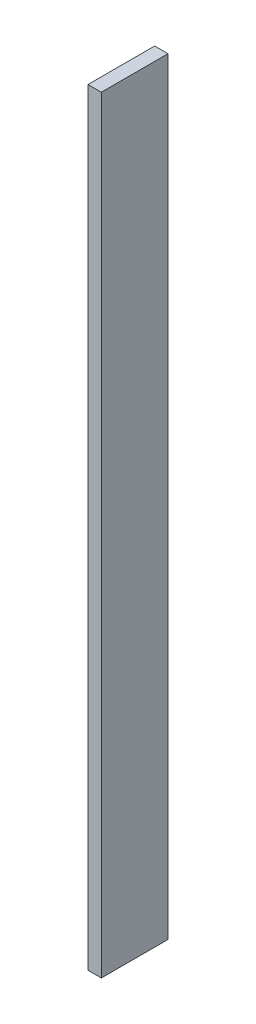
ISO-10303-21;
HEADER;
FILE_DESCRIPTION(('STEP AP214'),'2;1');
FILE_NAME('part.step','',(''),(''),'','','');
FILE_SCHEMA(('AUTOMOTIVE_DESIGN { 1 0 10303 214 1 1 1 1 }'));
ENDSEC;
DATA;
#1=APPLICATION_CONTEXT('core data for automotive mechanical design processes');
#2=APPLICATION_PROTOCOL_DEFINITION('international standard','automotive_design',2000,#1);
#3=PRODUCT_CONTEXT('',#1,'mechanical');
#4=PRODUCT('Part','Part','',(#3));
#5=PRODUCT_RELATED_PRODUCT_CATEGORY('part','',(#4));
#6=PRODUCT_DEFINITION_FORMATION('','',#4);
#7=PRODUCT_DEFINITION_CONTEXT('part definition',#1,'design');
#8=PRODUCT_DEFINITION('design','',#6,#7);
#9=PRODUCT_DEFINITION_SHAPE('','',#8);
#10=(LENGTH_UNIT() NAMED_UNIT(*) SI_UNIT(.MILLI.,.METRE.));
#11=(NAMED_UNIT(*) PLANE_ANGLE_UNIT() SI_UNIT($,.RADIAN.));
#12=(NAMED_UNIT(*) SI_UNIT($,.STERADIAN.) SOLID_ANGLE_UNIT());
#13=UNCERTAINTY_MEASURE_WITH_UNIT(LENGTH_MEASURE(1.E-05),#10,'distance_accuracy_value','');
#14=(GEOMETRIC_REPRESENTATION_CONTEXT(3) GLOBAL_UNCERTAINTY_ASSIGNED_CONTEXT((#13)) GLOBAL_UNIT_ASSIGNED_CONTEXT((#10,
#11,#12)) REPRESENTATION_CONTEXT('',''));
#15=CARTESIAN_POINT('',(0.,0.,0.));
#16=DIRECTION('',(0.,0.,1.));
#17=DIRECTION('',(1.,0.,0.));
#18=AXIS2_PLACEMENT_3D('',#15,#16,#17);
#19=CARTESIAN_POINT('',(0.188536082474265,584.2,25.104006109202));
#20=DIRECTION('',(-1.,0.,0.));
#21=DIRECTION('',(0.,0.,1.));
#22=AXIS2_PLACEMENT_3D('',#19,#20,#21);
#23=PLANE('',#22);
#24=DIRECTION('',(0.,0.,-1.));
#25=VECTOR('',#24,1.);
#26=CARTESIAN_POINT('',(0.188536082474265,0.,25.104006109202));
#27=LINE('',#26,#25);
#28=CARTESIAN_POINT('',(0.188536082474265,0.,25.104006109202));
#29=VERTEX_POINT('',#28);
#30=CARTESIAN_POINT('',(0.188536082474265,0.,-25.695993890798));
#31=VERTEX_POINT('',#30);
#32=EDGE_CURVE('E100',#29,#31,#27,.T.);
#33=ORIENTED_EDGE('',*,*,#32,.T.);
#34=DIRECTION('',(0.,-1.,0.));
#35=VECTOR('',#34,1.);
#36=CARTESIAN_POINT('',(0.188536082474265,584.2,-25.695993890798));
#37=LINE('',#36,#35);
#38=CARTESIAN_POINT('',(0.188536082474265,584.2,-25.695993890798));
#39=VERTEX_POINT('',#38);
#40=EDGE_CURVE('E11',#39,#31,#37,.T.);
#41=ORIENTED_EDGE('',*,*,#40,.F.);
#42=DIRECTION('',(0.,0.,-1.));
#43=VECTOR('',#42,1.);
#44=CARTESIAN_POINT('',(0.188536082474265,584.2,25.104006109202));
#45=LINE('',#44,#43);
#46=CARTESIAN_POINT('',(0.188536082474265,584.2,25.104006109202));
#47=VERTEX_POINT('',#46);
#48=EDGE_CURVE('E88',#47,#39,#45,.T.);
#49=ORIENTED_EDGE('',*,*,#48,.F.);
#50=DIRECTION('',(0.,-1.,0.));
#51=VECTOR('',#50,1.);
#52=CARTESIAN_POINT('',(0.188536082474265,584.2,25.104006109202));
#53=LINE('',#52,#51);
#54=EDGE_CURVE('E96',#47,#29,#53,.T.);
#55=ORIENTED_EDGE('',*,*,#54,.T.);
#56=EDGE_LOOP('',(#33,#41,#49,#55));
#57=FACE_BOUND('',#56,.T.);
#58=ADVANCED_FACE('F37',(#57),#23,.F.);
#59=CARTESIAN_POINT('',(-9.97146391752574,584.2,-25.695993890798));
#60=DIRECTION('',(0.,0.,1.));
#61=DIRECTION('',(1.,0.,0.));
#62=AXIS2_PLACEMENT_3D('',#59,#60,#61);
#63=PLANE('',#62);
#64=DIRECTION('',(-1.,0.,0.));
#65=VECTOR('',#64,1.);
#66=CARTESIAN_POINT('',(-9.97146391752574,0.,-25.695993890798));
#67=LINE('',#66,#65);
#68=CARTESIAN_POINT('',(-9.97146391752574,0.,-25.695993890798));
#69=VERTEX_POINT('',#68);
#70=EDGE_CURVE('E92',#31,#69,#67,.T.);
#71=ORIENTED_EDGE('',*,*,#70,.T.);
#72=DIRECTION('',(0.,-1.,0.));
#73=VECTOR('',#72,1.);
#74=CARTESIAN_POINT('',(-9.97146391752574,584.2,-25.695993890798));
#75=LINE('',#74,#73);
#76=CARTESIAN_POINT('',(-9.97146391752574,584.2,-25.695993890798));
#77=VERTEX_POINT('',#76);
#78=EDGE_CURVE('E45',#77,#69,#75,.T.);
#79=ORIENTED_EDGE('',*,*,#78,.F.);
#80=DIRECTION('',(-1.,0.,0.));
#81=VECTOR('',#80,1.);
#82=CARTESIAN_POINT('',(-9.97146391752574,584.2,-25.695993890798));
#83=LINE('',#82,#81);
#84=EDGE_CURVE('E83',#39,#77,#83,.T.);
#85=ORIENTED_EDGE('',*,*,#84,.F.);
#86=ORIENTED_EDGE('',*,*,#40,.T.);
#87=EDGE_LOOP('',(#71,#79,#85,#86));
#88=FACE_BOUND('',#87,.T.);
#89=ADVANCED_FACE('F91',(#88),#63,.F.);
#90=CARTESIAN_POINT('',(-9.97146391752574,584.2,25.104006109202));
#91=DIRECTION('',(1.,0.,0.));
#92=DIRECTION('',(0.,0.,-1.));
#93=AXIS2_PLACEMENT_3D('',#90,#91,#92);
#94=PLANE('',#93);
#95=DIRECTION('',(0.,0.,1.));
#96=VECTOR('',#95,1.);
#97=CARTESIAN_POINT('',(-9.97146391752574,0.,25.104006109202));
#98=LINE('',#97,#96);
#99=CARTESIAN_POINT('',(-9.97146391752574,0.,25.104006109202));
#100=VERTEX_POINT('',#99);
#101=EDGE_CURVE('E70',#69,#100,#98,.T.);
#102=ORIENTED_EDGE('',*,*,#101,.T.);
#103=DIRECTION('',(0.,-1.,0.));
#104=VECTOR('',#103,1.);
#105=CARTESIAN_POINT('',(-9.97146391752574,584.2,25.104006109202));
#106=LINE('',#105,#104);
#107=CARTESIAN_POINT('',(-9.97146391752574,584.2,25.104006109202));
#108=VERTEX_POINT('',#107);
#109=EDGE_CURVE('E93',#108,#100,#106,.T.);
#110=ORIENTED_EDGE('',*,*,#109,.F.);
#111=DIRECTION('',(0.,0.,1.));
#112=VECTOR('',#111,1.);
#113=CARTESIAN_POINT('',(-9.97146391752574,584.2,25.104006109202));
#114=LINE('',#113,#112);
#115=EDGE_CURVE('E86',#77,#108,#114,.T.);
#116=ORIENTED_EDGE('',*,*,#115,.F.);
#117=ORIENTED_EDGE('',*,*,#78,.T.);
#118=EDGE_LOOP('',(#102,#110,#116,#117));
#119=FACE_BOUND('',#118,.T.);
#120=ADVANCED_FACE('F94',(#119),#94,.F.);
#121=CARTESIAN_POINT('',(-9.97146391752574,584.2,25.104006109202));
#122=DIRECTION('',(0.,0.,-1.));
#123=DIRECTION('',(-1.,0.,0.));
#124=AXIS2_PLACEMENT_3D('',#121,#122,#123);
#125=PLANE('',#124);
#126=DIRECTION('',(1.,0.,0.));
#127=VECTOR('',#126,1.);
#128=CARTESIAN_POINT('',(-9.97146391752574,0.,25.104006109202));
#129=LINE('',#128,#127);
#130=EDGE_CURVE('E76',#100,#29,#129,.T.);
#131=ORIENTED_EDGE('',*,*,#130,.T.);
#132=ORIENTED_EDGE('',*,*,#54,.F.);
#133=DIRECTION('',(1.,0.,0.));
#134=VECTOR('',#133,1.);
#135=CARTESIAN_POINT('',(-9.97146391752574,584.2,25.104006109202));
#136=LINE('',#135,#134);
#137=EDGE_CURVE('E53',#108,#47,#136,.T.);
#138=ORIENTED_EDGE('',*,*,#137,.F.);
#139=ORIENTED_EDGE('',*,*,#109,.T.);
#140=EDGE_LOOP('',(#131,#132,#138,#139));
#141=FACE_BOUND('',#140,.T.);
#142=ADVANCED_FACE('F107',(#141),#125,.F.);
#143=CARTESIAN_POINT('',(0.,584.2,0.));
#144=DIRECTION('',(0.,-1.,0.));
#145=DIRECTION('',(0.,0.,-1.));
#146=AXIS2_PLACEMENT_3D('',#143,#144,#145);
#147=PLANE('',#146);
#148=ORIENTED_EDGE('',*,*,#48,.T.);
#149=ORIENTED_EDGE('',*,*,#84,.T.);
#150=ORIENTED_EDGE('',*,*,#115,.T.);
#151=ORIENTED_EDGE('',*,*,#137,.T.);
#152=EDGE_LOOP('',(#148,#149,#150,#151));
#153=FACE_BOUND('',#152,.T.);
#154=ADVANCED_FACE('F84',(#153),#147,.F.);
#155=CARTESIAN_POINT('',(0.,0.,0.));
#156=DIRECTION('',(0.,-1.,0.));
#157=DIRECTION('',(0.,0.,-1.));
#158=AXIS2_PLACEMENT_3D('',#155,#156,#157);
#159=PLANE('',#158);
#160=ORIENTED_EDGE('',*,*,#32,.F.);
#161=ORIENTED_EDGE('',*,*,#130,.F.);
#162=ORIENTED_EDGE('',*,*,#101,.F.);
#163=ORIENTED_EDGE('',*,*,#70,.F.);
#164=EDGE_LOOP('',(#160,#161,#162,#163));
#165=FACE_BOUND('',#164,.T.);
#166=ADVANCED_FACE('F110',(#165),#159,.T.);
#167=CLOSED_SHELL('',(#58,#89,#120,#142,#154,#166));
#168=MANIFOLD_SOLID_BREP('B2',#167);
#169=ADVANCED_BREP_SHAPE_REPRESENTATION('',(#18,#168),#14);
#170=SHAPE_DEFINITION_REPRESENTATION(#9,#169);
ENDSEC;
END-ISO-10303-21;
